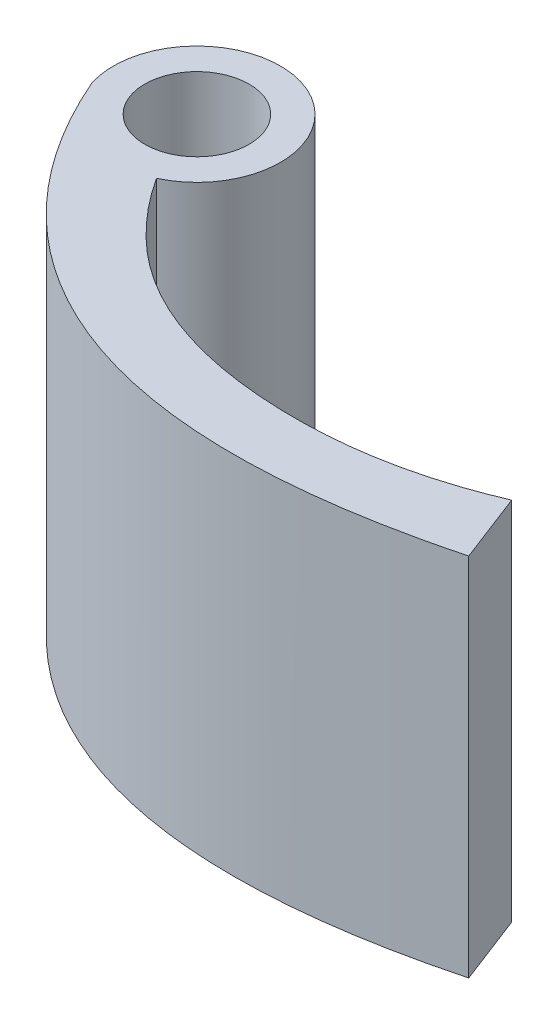
ISO-10303-21;
HEADER;
FILE_DESCRIPTION(('STEP AP214'),'2;1');
FILE_NAME('part.step','',(''),(''),'','','');
FILE_SCHEMA(('AUTOMOTIVE_DESIGN { 1 0 10303 214 1 1 1 1 }'));
ENDSEC;
DATA;
#1=APPLICATION_CONTEXT('core data for automotive mechanical design processes');
#2=APPLICATION_PROTOCOL_DEFINITION('international standard','automotive_design',2000,#1);
#3=PRODUCT_CONTEXT('',#1,'mechanical');
#4=PRODUCT('Part','Part','',(#3));
#5=PRODUCT_RELATED_PRODUCT_CATEGORY('part','',(#4));
#6=PRODUCT_DEFINITION_FORMATION('','',#4);
#7=PRODUCT_DEFINITION_CONTEXT('part definition',#1,'design');
#8=PRODUCT_DEFINITION('design','',#6,#7);
#9=PRODUCT_DEFINITION_SHAPE('','',#8);
#10=(LENGTH_UNIT() NAMED_UNIT(*) SI_UNIT(.MILLI.,.METRE.));
#11=(NAMED_UNIT(*) PLANE_ANGLE_UNIT() SI_UNIT($,.RADIAN.));
#12=(NAMED_UNIT(*) SI_UNIT($,.STERADIAN.) SOLID_ANGLE_UNIT());
#13=UNCERTAINTY_MEASURE_WITH_UNIT(LENGTH_MEASURE(1.E-05),#10,'distance_accuracy_value','');
#14=(GEOMETRIC_REPRESENTATION_CONTEXT(3) GLOBAL_UNCERTAINTY_ASSIGNED_CONTEXT((#13)) GLOBAL_UNIT_ASSIGNED_CONTEXT((#10,
#11,#12)) REPRESENTATION_CONTEXT('',''));
#15=CARTESIAN_POINT('',(0.,0.,0.));
#16=DIRECTION('',(0.,0.,1.));
#17=DIRECTION('',(1.,0.,0.));
#18=AXIS2_PLACEMENT_3D('',#15,#16,#17);
#19=CARTESIAN_POINT('',(23.5418795945372,17.5,8.46845520362058));
#20=CARTESIAN_POINT('',(23.5418795945372,0.,8.46845520362058));
#21=CARTESIAN_POINT('',(19.0409249862092,17.5,10.4028454268517));
#22=CARTESIAN_POINT('',(19.0409249862092,0.,10.4028454268517));
#23=CARTESIAN_POINT('',(7.80522684116914,17.5,10.0394228017009));
#24=CARTESIAN_POINT('',(7.80522684116914,0.,10.0394228017009));
#25=CARTESIAN_POINT('',(2.72032425599838,17.5,5.2184871640726));
#26=CARTESIAN_POINT('',(2.72032425599838,0.,5.2184871640726));
#27=CARTESIAN_POINT('',(1.68961459833319,17.5,3.62563132558998));
#28=CARTESIAN_POINT('',(1.68961459833319,0.,3.62563132558998));
#29=B_SPLINE_SURFACE_WITH_KNOTS('',2,1,((#19,#20),(#21,#22),(#23,#24),(#25,#26),(#27,#28)),
.UNSPECIFIED.,.F.,.F.,.F.,(3,1,1,3),(2,2),(0.17505628759707,0.470264311615387,0.86018861941257,
1.),(0.,1.),.UNSPECIFIED.);
#30=DIRECTION('',(0.,-1.,0.));
#31=VECTOR('',#30,1.);
#32=CARTESIAN_POINT('',(1.68961459833319,17.5,3.62563132558998));
#33=LINE('',#32,#31);
#34=CARTESIAN_POINT('',(1.68961459833319,17.5,3.62563132558998));
#35=VERTEX_POINT('',#34);
#36=CARTESIAN_POINT('',(1.68961459833319,0.,3.62563132558998));
#37=VERTEX_POINT('',#36);
#38=EDGE_CURVE('E57',#35,#37,#33,.T.);
#39=CARTESIAN_POINT('',(1.68961459833319,17.5,3.62563132558998));
#40=CARTESIAN_POINT('',(1.79742893716146,17.5,3.79225865819014));
#41=CARTESIAN_POINT('',(1.90825725271313,17.5,3.95694270049313));
#42=CARTESIAN_POINT('',(2.13610975059026,17.5,4.28241168820125));
#43=CARTESIAN_POINT('',(2.25314480809976,17.5,4.44318901829129));
#44=CARTESIAN_POINT('',(2.49331792271185,17.5,4.7603978188839));
#45=CARTESIAN_POINT('',(2.61646248468633,17.5,4.91682436808388));
#46=CARTESIAN_POINT('',(2.86870225490145,17.5,5.22492052723039));
#47=CARTESIAN_POINT('',(2.99780010579572,17.5,5.37658797343195));
#48=CARTESIAN_POINT('',(3.26116791849547,17.5,5.67412904320811));
#49=CARTESIAN_POINT('',(3.39541133849376,17.5,5.8200261217978));
#50=CARTESIAN_POINT('',(3.60090870490553,17.5,6.03485942709481));
#51=CARTESIAN_POINT('',(3.67008653774347,17.5,6.10579213953776));
#52=CARTESIAN_POINT('',(3.80981560194832,17.5,6.24629470557353));
#53=CARTESIAN_POINT('',(3.88036685337873,17.5,6.31586453922697));
#54=CARTESIAN_POINT('',(4.02274332472523,17.5,6.45362141051685));
#55=CARTESIAN_POINT('',(4.09456791553023,17.5,6.52180909719169));
#56=CARTESIAN_POINT('',(4.23984114982229,17.5,6.6564305588526));
#57=CARTESIAN_POINT('',(4.31328973988117,17.5,6.72286439138168));
#58=CARTESIAN_POINT('',(4.46173662228513,17.5,6.85395330264662));
#59=CARTESIAN_POINT('',(4.53673467356528,17.5,6.91860865448297));
#60=CARTESIAN_POINT('',(4.68826351092775,17.5,7.046103420793));
#61=CARTESIAN_POINT('',(4.76479436443847,17.5,7.10894275508121));
#62=CARTESIAN_POINT('',(4.94610376805075,17.5,7.25420740243292));
#63=CARTESIAN_POINT('',(5.05148726410361,17.5,7.33588002515753));
#64=CARTESIAN_POINT('',(5.26483189512984,17.5,7.49577866829648));
#65=CARTESIAN_POINT('',(5.37279307187863,17.5,7.57400463279368));
#66=CARTESIAN_POINT('',(5.70044818129108,17.5,7.80346757368113));
#67=CARTESIAN_POINT('',(5.92385970174721,17.5,7.94944636033349));
#68=CARTESIAN_POINT('',(6.37944578145599,17.5,8.22697814339554));
#69=CARTESIAN_POINT('',(6.61162062681711,17.5,8.35853066826241));
#70=CARTESIAN_POINT('',(7.08347802508193,17.5,8.60706969855418));
#71=CARTESIAN_POINT('',(7.32315659868628,17.5,8.72406376603248));
#72=CARTESIAN_POINT('',(7.80897296275063,17.5,8.94370749564517));
#73=CARTESIAN_POINT('',(8.05511050788914,17.5,9.04635770164712));
#74=CARTESIAN_POINT('',(8.55273735347587,17.5,9.23767056843271));
#75=CARTESIAN_POINT('',(8.80422658843294,17.5,9.32633340027487));
#76=CARTESIAN_POINT('',(9.37861476273707,17.5,9.51184684719253));
#77=CARTESIAN_POINT('',(9.70281812356134,17.5,9.60466704653406));
#78=CARTESIAN_POINT('',(10.3564059279472,17.5,9.77006946340878));
#79=CARTESIAN_POINT('',(10.6857919966434,17.5,9.84264519370544));
#80=CARTESIAN_POINT('',(11.3482013827009,17.5,9.96898652547715));
#81=CARTESIAN_POINT('',(11.6812255137861,17.5,10.0227478260718));
#82=CARTESIAN_POINT('',(12.3507511028208,17.5,10.1130888000342));
#83=CARTESIAN_POINT('',(12.6872606495866,17.5,10.1496077140701));
#84=CARTESIAN_POINT('',(13.3615563162684,17.5,10.2066583780304));
#85=CARTESIAN_POINT('',(13.6993421957967,17.5,10.2271930010493));
#86=CARTESIAN_POINT('',(14.2064197847899,17.5,10.2470775424825));
#87=CARTESIAN_POINT('',(14.3755175594851,17.5,10.2518861364934));
#88=CARTESIAN_POINT('',(14.7137783713298,17.5,10.2576447090449));
#89=CARTESIAN_POINT('',(14.882941407882,17.5,10.2585947220956));
#90=CARTESIAN_POINT('',(15.4084969940953,17.5,10.255520176609));
#91=CARTESIAN_POINT('',(15.7648752123894,17.5,10.2448254542903));
#92=CARTESIAN_POINT('',(16.4766362091217,17.5,10.2058791316273));
#93=CARTESIAN_POINT('',(16.8320190534104,17.5,10.1776287216498));
#94=CARTESIAN_POINT('',(17.5409487971854,17.5,10.1034317676877));
#95=CARTESIAN_POINT('',(17.894495647915,17.5,10.0574847561615));
#96=CARTESIAN_POINT('',(18.5976596109128,17.5,9.94810661541723));
#97=CARTESIAN_POINT('',(18.9472859222005,17.5,9.8847345972942));
#98=CARTESIAN_POINT('',(19.6429467993597,17.5,9.74064574064057));
#99=CARTESIAN_POINT('',(19.9889813456516,17.5,9.65992880761108));
#100=CARTESIAN_POINT('',(20.6765270212143,17.5,9.48155653006617));
#101=CARTESIAN_POINT('',(21.018039631,17.5,9.38390688483203));
#102=CARTESIAN_POINT('',(21.7277888124359,17.5,9.16220924181312));
#103=CARTESIAN_POINT('',(22.0955197985764,17.5,9.03654262418113));
#104=CARTESIAN_POINT('',(22.8240915503298,17.5,8.76638971190001));
#105=CARTESIAN_POINT('',(23.1849309210635,17.5,8.62189965267261));
#106=CARTESIAN_POINT('',(23.5418795945372,17.5,8.46845520362058));
#107=B_SPLINE_CURVE_WITH_KNOTS('',3,(#39,#40,#41,#42,#43,#44,#45,#46,#47,#48,#49,#50,#51,#52,
#53,#54,#55,#56,#57,#58,#59,#60,#61,#62,#63,#64,#65,#66,#67,#68,#69,#70,#71,#72,#73,#74,#75,#76,
#77,#78,#79,#80,#81,#82,#83,#84,#85,#86,#87,#88,#89,#90,#91,#92,#93,#94,#95,#96,#97,#98,#99,
#100,#101,#102,#103,#104,#105,#106),.UNSPECIFIED.,.F.,.F.,(4,2,2,2,2,2,2,2,2,2,2,2,2,2,2,2,2,2,
2,2,2,2,2,2,2,2,2,2,2,2,2,2,2,4),(0.,0.595373025180184,1.19182611590377,1.78892848903527,
2.38629851531379,2.98091891255163,3.2781457209828,3.57537687469617,3.87246505813082,
4.16954348211604,4.4665760296479,4.76362167254798,5.16352665045545,5.56343811386557,
6.36346816489227,7.16352435824588,7.96316323071633,8.76277177552837,9.56237054077345,
10.573322896226,11.5845988350064,12.5961057954167,13.6111510173321,14.6260137479118,
15.133477787213,15.6409372878901,16.7100913971856,17.7791730201812,18.8482828900875,
19.9138098201943,20.9793425556723,22.0445173434853,23.2098194851185,24.3753550391754),.UNSPECIFIED.);
#108=CARTESIAN_POINT('',(23.5418795945372,17.5,8.46845520362058));
#109=VERTEX_POINT('',#108);
#110=EDGE_CURVE('E60',#35,#109,#107,.T.);
#111=DIRECTION('',(0.,1.,0.));
#112=VECTOR('',#111,1.);
#113=CARTESIAN_POINT('',(23.5418795945372,17.5,8.46845520362058));
#114=LINE('',#113,#112);
#115=CARTESIAN_POINT('',(23.5418795945372,0.,8.46845520362058));
#116=VERTEX_POINT('',#115);
#117=EDGE_CURVE('E90',#109,#116,#114,.F.);
#118=CARTESIAN_POINT('',(1.68961459833319,0.,3.62563132558998));
#119=CARTESIAN_POINT('',(1.79742893716146,0.,3.79225865819014));
#120=CARTESIAN_POINT('',(1.90825725271313,0.,3.95694270049313));
#121=CARTESIAN_POINT('',(2.13610975059026,0.,4.28241168820125));
#122=CARTESIAN_POINT('',(2.25314480809976,0.,4.4431890182913));
#123=CARTESIAN_POINT('',(2.49331792271185,0.,4.7603978188839));
#124=CARTESIAN_POINT('',(2.61646248468633,0.,4.91682436808388));
#125=CARTESIAN_POINT('',(2.86870225490145,0.,5.22492052723039));
#126=CARTESIAN_POINT('',(2.99780010579572,0.,5.37658797343196));
#127=CARTESIAN_POINT('',(3.26116791849547,0.,5.67412904320811));
#128=CARTESIAN_POINT('',(3.39541133849376,0.,5.82002612179781));
#129=CARTESIAN_POINT('',(3.60090870490553,0.,6.03485942709481));
#130=CARTESIAN_POINT('',(3.67008653774347,0.,6.10579213953777));
#131=CARTESIAN_POINT('',(3.80981560194832,0.,6.24629470557353));
#132=CARTESIAN_POINT('',(3.88036685337873,0.,6.31586453922697));
#133=CARTESIAN_POINT('',(4.02274332472524,0.,6.45362141051685));
#134=CARTESIAN_POINT('',(4.09456791553023,0.,6.52180909719169));
#135=CARTESIAN_POINT('',(4.23984114982229,0.,6.6564305588526));
#136=CARTESIAN_POINT('',(4.31328973988117,0.,6.72286439138168));
#137=CARTESIAN_POINT('',(4.46173662228513,0.,6.85395330264662));
#138=CARTESIAN_POINT('',(4.53673467356528,0.,6.91860865448297));
#139=CARTESIAN_POINT('',(4.68826351092775,0.,7.046103420793));
#140=CARTESIAN_POINT('',(4.76479436443847,0.,7.10894275508121));
#141=CARTESIAN_POINT('',(4.94610376805075,0.,7.25420740243292));
#142=CARTESIAN_POINT('',(5.05148726410362,0.,7.33588002515753));
#143=CARTESIAN_POINT('',(5.26483189512984,0.,7.49577866829648));
#144=CARTESIAN_POINT('',(5.37279307187863,0.,7.57400463279368));
#145=CARTESIAN_POINT('',(5.70044818129108,0.,7.80346757368113));
#146=CARTESIAN_POINT('',(5.92385970174721,0.,7.94944636033349));
#147=CARTESIAN_POINT('',(6.37944578145599,0.,8.22697814339554));
#148=CARTESIAN_POINT('',(6.6116206268171,0.,8.35853066826241));
#149=CARTESIAN_POINT('',(7.08347802508193,0.,8.60706969855418));
#150=CARTESIAN_POINT('',(7.32315659868628,0.,8.72406376603248));
#151=CARTESIAN_POINT('',(7.80897296275063,0.,8.94370749564517));
#152=CARTESIAN_POINT('',(8.05511050788914,0.,9.04635770164712));
#153=CARTESIAN_POINT('',(8.55273735347587,0.,9.23767056843271));
#154=CARTESIAN_POINT('',(8.80422658843293,0.,9.32633340027487));
#155=CARTESIAN_POINT('',(9.37861476273707,0.,9.51184684719253));
#156=CARTESIAN_POINT('',(9.70281812356134,0.,9.60466704653406));
#157=CARTESIAN_POINT('',(10.3564059279472,0.,9.77006946340878));
#158=CARTESIAN_POINT('',(10.6857919966434,0.,9.84264519370544));
#159=CARTESIAN_POINT('',(11.3482013827009,0.,9.96898652547715));
#160=CARTESIAN_POINT('',(11.6812255137861,0.,10.0227478260718));
#161=CARTESIAN_POINT('',(12.3507511028208,0.,10.1130888000342));
#162=CARTESIAN_POINT('',(12.6872606495866,0.,10.1496077140701));
#163=CARTESIAN_POINT('',(13.3615563162684,0.,10.2066583780304));
#164=CARTESIAN_POINT('',(13.6993421957967,0.,10.2271930010493));
#165=CARTESIAN_POINT('',(14.2064197847899,0.,10.2470775424825));
#166=CARTESIAN_POINT('',(14.3755175594851,0.,10.2518861364934));
#167=CARTESIAN_POINT('',(14.7137783713298,0.,10.2576447090449));
#168=CARTESIAN_POINT('',(14.882941407882,0.,10.2585947220956));
#169=CARTESIAN_POINT('',(15.4084969940953,0.,10.255520176609));
#170=CARTESIAN_POINT('',(15.7648752123895,0.,10.2448254542903));
#171=CARTESIAN_POINT('',(16.4766362091217,0.,10.2058791316273));
#172=CARTESIAN_POINT('',(16.8320190534104,0.,10.1776287216498));
#173=CARTESIAN_POINT('',(17.5409487971854,0.,10.1034317676877));
#174=CARTESIAN_POINT('',(17.894495647915,0.,10.0574847561615));
#175=CARTESIAN_POINT('',(18.5976596109128,0.,9.94810661541723));
#176=CARTESIAN_POINT('',(18.9472859222006,0.,9.88473459729419));
#177=CARTESIAN_POINT('',(19.6429467993597,0.,9.74064574064056));
#178=CARTESIAN_POINT('',(19.9889813456516,0.,9.65992880761108));
#179=CARTESIAN_POINT('',(20.6765270212143,0.,9.48155653006617));
#180=CARTESIAN_POINT('',(21.018039631,0.,9.38390688483203));
#181=CARTESIAN_POINT('',(21.7277888124359,0.,9.16220924181312));
#182=CARTESIAN_POINT('',(22.0955197985764,0.,9.03654262418112));
#183=CARTESIAN_POINT('',(22.8240915503298,0.,8.76638971190001));
#184=CARTESIAN_POINT('',(23.1849309210635,0.,8.62189965267261));
#185=CARTESIAN_POINT('',(23.5418795945372,0.,8.46845520362058));
#186=B_SPLINE_CURVE_WITH_KNOTS('',3,(#118,#119,#120,#121,#122,#123,#124,#125,#126,#127,#128,
#129,#130,#131,#132,#133,#134,#135,#136,#137,#138,#139,#140,#141,#142,#143,#144,#145,#146,#147,
#148,#149,#150,#151,#152,#153,#154,#155,#156,#157,#158,#159,#160,#161,#162,#163,#164,#165,#166,
#167,#168,#169,#170,#171,#172,#173,#174,#175,#176,#177,#178,#179,#180,#181,#182,#183,#184,#185),
.UNSPECIFIED.,.F.,.F.,(4,2,2,2,2,2,2,2,2,2,2,2,2,2,2,2,2,2,2,2,2,2,2,2,2,2,2,2,2,2,2,2,2,4),(0.,
0.595373025180184,1.19182611590377,1.78892848903527,2.38629851531379,2.98091891255163,
3.2781457209828,3.57537687469617,3.87246505813082,4.16954348211604,4.4665760296479,
4.76362167254798,5.16352665045545,5.56343811386557,6.36346816489227,7.16352435824588,
7.96316323071633,8.76277177552837,9.56237054077345,10.573322896226,11.5845988350064,
12.5961057954167,13.6111510173321,14.6260137479118,15.133477787213,15.6409372878901,
16.7100913971856,17.7791730201812,18.8482828900876,19.9138098201943,20.9793425556723,
22.0445173434853,23.2098194851185,24.3753550391754),.UNSPECIFIED.);
#187=EDGE_CURVE('E62',#37,#116,#186,.T.);
#188=ORIENTED_EDGE('',*,*,#38,.F.);
#189=ORIENTED_EDGE('',*,*,#110,.T.);
#190=ORIENTED_EDGE('',*,*,#117,.T.);
#191=ORIENTED_EDGE('',*,*,#187,.F.);
#192=EDGE_LOOP('',(#188,#189,#190,#191));
#193=FACE_BOUND('',#192,.T.);
#194=ADVANCED_FACE('F17',(#193),#29,.F.);
#195=CARTESIAN_POINT('',(0.,17.5,0.));
#196=DIRECTION('',(0.,-1.,0.));
#197=DIRECTION('',(0.,0.,-1.));
#198=AXIS2_PLACEMENT_3D('',#195,#196,#197);
#199=CYLINDRICAL_SURFACE('',#198,2.5);
#200=CARTESIAN_POINT('',(0.,17.5,0.));
#201=DIRECTION('',(0.,-1.,0.));
#202=DIRECTION('',(0.,0.,-1.));
#203=AXIS2_PLACEMENT_3D('',#200,#201,#202);
#204=CIRCLE('',#203,2.5);
#205=CARTESIAN_POINT('',(0.,17.5,-2.5));
#206=VERTEX_POINT('',#205);
#207=EDGE_CURVE('E74',#206,#206,#204,.F.);
#208=ORIENTED_EDGE('',*,*,#207,.T.);
#209=EDGE_LOOP('',(#208));
#210=FACE_BOUND('',#209,.T.);
#211=CARTESIAN_POINT('',(0.,0.,0.));
#212=DIRECTION('',(0.,-1.,0.));
#213=DIRECTION('',(0.,0.,-1.));
#214=AXIS2_PLACEMENT_3D('',#211,#212,#213);
#215=CIRCLE('',#214,2.5);
#216=CARTESIAN_POINT('',(0.,0.,-2.5));
#217=VERTEX_POINT('',#216);
#218=EDGE_CURVE('E82',#217,#217,#215,.F.);
#219=ORIENTED_EDGE('',*,*,#218,.F.);
#220=EDGE_LOOP('',(#219));
#221=FACE_BOUND('',#220,.T.);
#222=ADVANCED_FACE('F118',(#210,#221),#199,.F.);
#223=CARTESIAN_POINT('',(0.,17.5,0.));
#224=DIRECTION('',(0.,-1.,0.));
#225=DIRECTION('',(0.,0.,-1.));
#226=AXIS2_PLACEMENT_3D('',#223,#224,#225);
#227=CYLINDRICAL_SURFACE('',#226,4.);
#228=CARTESIAN_POINT('',(0.,0.,0.));
#229=DIRECTION('',(0.,-1.,0.));
#230=DIRECTION('',(0.,0.,-1.));
#231=AXIS2_PLACEMENT_3D('',#228,#229,#230);
#232=CIRCLE('',#231,4.);
#233=CARTESIAN_POINT('',(-3.80556884538777,0.,1.23192766143714));
#234=VERTEX_POINT('',#233);
#235=EDGE_CURVE('E79',#234,#37,#232,.T.);
#236=ORIENTED_EDGE('',*,*,#235,.F.);
#237=DIRECTION('',(0.,1.,0.));
#238=VECTOR('',#237,1.);
#239=CARTESIAN_POINT('',(-3.80556884538777,8.75,1.23192766143714));
#240=LINE('',#239,#238);
#241=CARTESIAN_POINT('',(-3.80556884538777,17.5,1.23192766143714));
#242=VERTEX_POINT('',#241);
#243=EDGE_CURVE('E78',#234,#242,#240,.T.);
#244=ORIENTED_EDGE('',*,*,#243,.T.);
#245=CARTESIAN_POINT('',(0.,17.5,0.));
#246=DIRECTION('',(0.,-1.,0.));
#247=DIRECTION('',(0.,0.,-1.));
#248=AXIS2_PLACEMENT_3D('',#245,#246,#247);
#249=CIRCLE('',#248,4.);
#250=EDGE_CURVE('E24',#242,#35,#249,.T.);
#251=ORIENTED_EDGE('',*,*,#250,.T.);
#252=ORIENTED_EDGE('',*,*,#38,.T.);
#253=EDGE_LOOP('',(#236,#244,#251,#252));
#254=FACE_BOUND('',#253,.T.);
#255=ADVANCED_FACE('F76',(#254),#227,.T.);
#256=CARTESIAN_POINT('',(10.5934418884606,17.5,9.81962069741123));
#257=DIRECTION('',(0.,-1.,0.));
#258=DIRECTION('',(0.,0.,-1.));
#259=AXIS2_PLACEMENT_3D('',#256,#257,#258);
#260=PLANE('',#259);
#261=ORIENTED_EDGE('',*,*,#207,.F.);
#262=EDGE_LOOP('',(#261));
#263=FACE_BOUND('',#262,.T.);
#264=ORIENTED_EDGE('',*,*,#250,.F.);
#265=CARTESIAN_POINT('',(-3.80556884538777,17.5,1.23192766143714));
#266=CARTESIAN_POINT('',(-3.74806260160153,17.5,1.36407463491607));
#267=CARTESIAN_POINT('',(-3.68942044940947,17.5,1.49572403299078));
#268=CARTESIAN_POINT('',(-3.56985687977397,17.5,1.75798648824177));
#269=CARTESIAN_POINT('',(-3.50893542154176,17.5,1.88859952682138));
#270=CARTESIAN_POINT('',(-3.32258169203165,17.5,2.27915553993106));
#271=CARTESIAN_POINT('',(-3.1937104761506,17.5,2.53746944890253));
#272=CARTESIAN_POINT('',(-2.92641700606305,17.5,3.04932172797881));
#273=CARTESIAN_POINT('',(-2.78798864450031,17.5,3.30285691009652));
#274=CARTESIAN_POINT('',(-2.50124244517351,17.5,3.80433584784814));
#275=CARTESIAN_POINT('',(-2.35292304635494,17.5,4.05227871257088));
#276=CARTESIAN_POINT('',(-2.0455448754525,17.5,4.54301041943573));
#277=CARTESIAN_POINT('',(-1.88643988528078,17.5,4.78577034195914));
#278=CARTESIAN_POINT('',(-1.55811448599689,17.5,5.26424631446912));
#279=CARTESIAN_POINT('',(-1.38889720570972,17.5,5.49996450971246));
#280=CARTESIAN_POINT('',(-1.04035393879103,17.5,5.96372413182091));
#281=CARTESIAN_POINT('',(-0.861030456932846,17.5,6.19176743868594));
#282=CARTESIAN_POINT('',(-0.49229377393489,17.5,6.6395352935744));
#283=CARTESIAN_POINT('',(-0.302880718787468,17.5,6.85925996188676));
#284=CARTESIAN_POINT('',(0.152969268856561,17.5,7.36387275570645));
#285=CARTESIAN_POINT('',(0.423456292874136,17.5,7.64512457973667));
#286=CARTESIAN_POINT('',(0.982150972541489,17.5,8.18953889658161));
#287=CARTESIAN_POINT('',(1.27036165876602,17.5,8.45269827937938));
#288=CARTESIAN_POINT('',(1.86334209675524,17.5,8.95964025114364));
#289=CARTESIAN_POINT('',(2.16811179001211,17.5,9.20342290856631));
#290=CARTESIAN_POINT('',(2.79194673090215,17.5,9.66964283880401));
#291=CARTESIAN_POINT('',(3.1109583632599,17.5,9.89215165166703));
#292=CARTESIAN_POINT('',(3.59990430574197,17.5,10.209747070966));
#293=CARTESIAN_POINT('',(3.76463506427807,17.5,10.3129235618192));
#294=CARTESIAN_POINT('',(4.09741652456407,17.5,10.5137779775494));
#295=CARTESIAN_POINT('',(4.26546720220276,17.5,10.6114559423402));
#296=CARTESIAN_POINT('',(4.774191279381,17.5,10.8961521138022));
#297=CARTESIAN_POINT('',(5.11952630624187,17.5,11.0748906954618));
#298=CARTESIAN_POINT('',(5.9240733619031,17.5,11.459411130872));
#299=CARTESIAN_POINT('',(6.38689922123636,17.5,11.657679707714));
#300=CARTESIAN_POINT('',(7.0916510501915,17.5,11.9270366167184));
#301=CARTESIAN_POINT('',(7.32832823236788,17.5,12.0121501990994));
#302=CARTESIAN_POINT('',(7.8048176217886,17.5,12.1731022067232));
#303=CARTESIAN_POINT('',(8.04462980533238,17.5,12.2489407020406));
#304=CARTESIAN_POINT('',(8.768704673339,17.5,12.4629772092574));
#305=CARTESIAN_POINT('',(9.25706760236575,17.5,12.5874919653495));
#306=CARTESIAN_POINT('',(10.241323864699,17.5,12.8017987145127));
#307=CARTESIAN_POINT('',(10.737218290119,17.5,12.8915856208936));
#308=CARTESIAN_POINT('',(11.6224556768102,17.5,13.0221588883804));
#309=CARTESIAN_POINT('',(12.0108634426111,17.5,13.0694101456768));
#310=CARTESIAN_POINT('',(12.789510158126,17.5,13.1453082917107));
#311=CARTESIAN_POINT('',(13.1797493130722,17.5,13.1739530426437));
#312=CARTESIAN_POINT('',(14.3520769561725,17.5,13.2336994381172));
#313=CARTESIAN_POINT('',(15.1355782042629,17.5,13.2385853779101));
#314=CARTESIAN_POINT('',(16.7023867095151,17.5,13.1880808309422));
#315=CARTESIAN_POINT('',(17.485687986924,17.5,13.1325310839471));
#316=CARTESIAN_POINT('',(18.6562887072219,17.5,13.0104604641429));
#317=CARTESIAN_POINT('',(19.0457366826378,17.5,12.9633172392363));
#318=CARTESIAN_POINT('',(19.8230021859374,17.5,12.8571337222766));
#319=CARTESIAN_POINT('',(20.2108197826956,17.5,12.7980939380496));
#320=CARTESIAN_POINT('',(20.9551307005114,17.5,12.6738499883816));
#321=CARTESIAN_POINT('',(21.3117606861095,17.5,12.6094574890489));
#322=CARTESIAN_POINT('',(22.0232486951621,17.5,12.4717831400233));
#323=CARTESIAN_POINT('',(22.3781069612616,17.5,12.398502544415));
#324=CARTESIAN_POINT('',(22.9079150979006,17.5,12.2827682790239));
#325=CARTESIAN_POINT('',(23.0835374792932,17.5,12.2433587806763));
#326=CARTESIAN_POINT('',(23.4343478377058,17.5,12.1626485970846));
#327=CARTESIAN_POINT('',(23.6095358152143,17.5,12.1213479139677));
#328=CARTESIAN_POINT('',(23.9594807629354,17.5,12.036910677783));
#329=CARTESIAN_POINT('',(24.1342377035021,17.5,11.9937740019702));
#330=CARTESIAN_POINT('',(24.4832935374445,17.5,11.9056901204786));
#331=CARTESIAN_POINT('',(24.6575924337603,17.5,11.8607429264516));
#332=CARTESIAN_POINT('',(24.8316558001613,17.5,11.8149015748881));
#333=B_SPLINE_CURVE_WITH_KNOTS('',3,(#265,#266,#267,#268,#269,#270,#271,#272,#273,#274,#275,
#276,#277,#278,#279,#280,#281,#282,#283,#284,#285,#286,#287,#288,#289,#290,#291,#292,#293,#294,
#295,#296,#297,#298,#299,#300,#301,#302,#303,#304,#305,#306,#307,#308,#309,#310,#311,#312,#313,
#314,#315,#316,#317,#318,#319,#320,#321,#322,#323,#324,#325,#326,#327,#328,#329,#330,#331,#332),
.UNSPECIFIED.,.F.,.F.,(4,2,2,2,2,2,2,2,2,2,2,2,2,2,2,2,2,2,2,2,2,2,2,2,2,2,2,2,2,2,2,2,2,4),(0.,
0.432340284528741,0.864688309602565,1.7305154760349,2.59690115174656,3.46342389001117,
4.33392851163247,5.20416517272912,6.07418709036519,6.94419642252753,8.11400601925969,
9.28401620131199,10.4540222496435,11.6199441458104,12.2029784837624,12.7860085889285,
13.9517491301165,15.4604346127382,16.2148255781915,16.9692108437556,18.4797033840532,
19.9904170869232,21.163769907846,22.3372575179369,24.6848285503754,27.0386009237843,
28.2153226466725,29.3919941497008,30.4790708715796,31.5659943881336,32.1059556240501,
32.6459162526261,33.1859130370613,33.7259063468721),.UNSPECIFIED.);
#334=CARTESIAN_POINT('',(24.8316558001613,17.5,11.8149015748881));
#335=VERTEX_POINT('',#334);
#336=EDGE_CURVE('E81',#242,#335,#333,.T.);
#337=ORIENTED_EDGE('',*,*,#336,.T.);
#338=DIRECTION('',(0.35963031457441,0.,0.933094870224411));
#339=VECTOR('',#338,1.);
#340=CARTESIAN_POINT('',(23.5418795945372,17.5,8.46845520362058));
#341=LINE('',#340,#339);
#342=EDGE_CURVE('E73',#335,#109,#341,.F.);
#343=ORIENTED_EDGE('',*,*,#342,.T.);
#344=ORIENTED_EDGE('',*,*,#110,.F.);
#345=EDGE_LOOP('',(#264,#337,#343,#344));
#346=FACE_BOUND('',#345,.T.);
#347=ADVANCED_FACE('F70',(#263,#346),#260,.F.);
#348=CARTESIAN_POINT('',(23.5418795945372,17.5,8.46845520362058));
#349=DIRECTION('',(-0.933094870224411,0.,0.35963031457441));
#350=DIRECTION('',(0.35963031457441,0.,0.933094870224411));
#351=AXIS2_PLACEMENT_3D('',#348,#349,#350);
#352=PLANE('',#351);
#353=ORIENTED_EDGE('',*,*,#117,.F.);
#354=ORIENTED_EDGE('',*,*,#342,.F.);
#355=DIRECTION('',(0.,-1.,0.));
#356=VECTOR('',#355,1.);
#357=CARTESIAN_POINT('',(24.8316558001613,8.75,11.8149015748881));
#358=LINE('',#357,#356);
#359=CARTESIAN_POINT('',(24.8316558001613,0.,11.8149015748881));
#360=VERTEX_POINT('',#359);
#361=EDGE_CURVE('E30',#335,#360,#358,.T.);
#362=ORIENTED_EDGE('',*,*,#361,.T.);
#363=DIRECTION('',(0.359630314574409,0.,0.933094870224411));
#364=VECTOR('',#363,1.);
#365=CARTESIAN_POINT('',(23.5418795945372,0.,8.46845520362058));
#366=LINE('',#365,#364);
#367=EDGE_CURVE('E38',#116,#360,#366,.T.);
#368=ORIENTED_EDGE('',*,*,#367,.F.);
#369=EDGE_LOOP('',(#353,#354,#362,#368));
#370=FACE_BOUND('',#369,.T.);
#371=ADVANCED_FACE('F104',(#370),#352,.F.);
#372=CARTESIAN_POINT('',(10.5934418884606,0.,9.81962069741123));
#373=DIRECTION('',(0.,-1.,0.));
#374=DIRECTION('',(0.,0.,-1.));
#375=AXIS2_PLACEMENT_3D('',#372,#373,#374);
#376=PLANE('',#375);
#377=ORIENTED_EDGE('',*,*,#218,.T.);
#378=EDGE_LOOP('',(#377));
#379=FACE_BOUND('',#378,.T.);
#380=CARTESIAN_POINT('',(24.8316558001613,0.,11.8149015748881));
#381=CARTESIAN_POINT('',(24.6793574655154,0.,11.8550141212755));
#382=CARTESIAN_POINT('',(24.5268786913035,0.,11.8944378149481));
#383=CARTESIAN_POINT('',(24.2215691540658,0.,11.9719006558576));
#384=CARTESIAN_POINT('',(24.068738389505,0.,12.0099397970442));
#385=CARTESIAN_POINT('',(23.6097128548287,0.,12.1219746388422));
#386=CARTESIAN_POINT('',(23.3030053416287,0.,12.1938823577009));
#387=CARTESIAN_POINT('',(22.6870161040976,0.,12.3320521003183));
#388=CARTESIAN_POINT('',(22.3777289853659,0.,12.398290105803));
#389=CARTESIAN_POINT('',(21.7578238570635,0.,12.524193430478));
#390=CARTESIAN_POINT('',(21.4472058791179,0.,12.5838589049612));
#391=CARTESIAN_POINT('',(20.8242430046393,0.,12.6962644038735));
#392=CARTESIAN_POINT('',(20.5118962417806,0.,12.748994127946));
#393=CARTESIAN_POINT('',(19.8860496311574,0.,12.84707125125));
#394=CARTESIAN_POINT('',(19.5725497697148,0.,12.8924185626207));
#395=CARTESIAN_POINT('',(18.6192179974206,0.,13.0181535758136));
#396=CARTESIAN_POINT('',(17.977687832593,0.,13.0861896064652));
#397=CARTESIAN_POINT('',(16.6925063930492,0.,13.18499628004));
#398=CARTESIAN_POINT('',(16.0488587223628,0.,13.2158129018084));
#399=CARTESIAN_POINT('',(14.7613533493034,0.,13.2352606515065));
#400=CARTESIAN_POINT('',(14.1174963355301,0.,13.2239290457515));
#401=CARTESIAN_POINT('',(12.9103153351997,0.,13.1579730256435));
#402=CARTESIAN_POINT('',(12.3467023445291,0.,13.1087704920355));
#403=CARTESIAN_POINT('',(11.2243133138883,0.,12.9703007127936));
#404=CARTESIAN_POINT('',(10.6655375398837,0.,12.8810312782371));
#405=CARTESIAN_POINT('',(9.55928028542992,0.,12.6598858176035));
#406=CARTESIAN_POINT('',(9.0117556467398,0.,12.5282301168252));
#407=CARTESIAN_POINT('',(8.20024198542091,0.,12.296791948657));
#408=CARTESIAN_POINT('',(7.93133566928933,0.,12.2139752055124));
#409=CARTESIAN_POINT('',(7.39737566471026,0.,12.0367572597072));
#410=CARTESIAN_POINT('',(7.1323216997765,0.,11.9423568930502));
#411=CARTESIAN_POINT('',(6.51510926642851,0.,11.7069714508897));
#412=CARTESIAN_POINT('',(6.16475890806397,0.,11.5612113588107));
#413=CARTESIAN_POINT('',(5.47364070008153,0.,11.2484497263643));
#414=CARTESIAN_POINT('',(5.1328735175735,0.,11.0814467116691));
#415=CARTESIAN_POINT('',(4.4625375569393,0.,10.7262843754557));
#416=CARTESIAN_POINT('',(4.13296854328888,0.,10.538125499255));
#417=CARTESIAN_POINT('',(3.48646574742462,0.,10.1408080510479));
#418=CARTESIAN_POINT('',(3.16953960874463,0.,9.93163703664958));
#419=CARTESIAN_POINT('',(2.54974100290389,0.,9.49341204852243));
#420=CARTESIAN_POINT('',(2.24686905874711,0.,9.26435733576325));
#421=CARTESIAN_POINT('',(1.65636773232877,0.,8.78746018611437));
#422=CARTESIAN_POINT('',(1.36873557628617,0.,8.53962118823349));
#423=CARTESIAN_POINT('',(0.902854980750665,0.,8.11173662988032));
#424=CARTESIAN_POINT('',(0.720075243532042,0.,7.93659638752805));
#425=CARTESIAN_POINT('',(0.362001608268905,0.,7.5788157003193));
#426=CARTESIAN_POINT('',(0.186708097288756,0.,7.39617486861123));
#427=CARTESIAN_POINT('',(-0.327745401606978,0.,6.8377985395844));
#428=CARTESIAN_POINT('',(-0.655567229506614,0.,6.45152725667728));
#429=CARTESIAN_POINT('',(-1.28041641773467,0.,5.65469940523331));
#430=CARTESIAN_POINT('',(-1.57743290980276,0.,5.24413434543277));
#431=CARTESIAN_POINT('',(-1.99967046810384,0.,4.61291065780066));
#432=CARTESIAN_POINT('',(-2.1365331292211,0.,4.39994359442921));
#433=CARTESIAN_POINT('',(-2.40256739538478,0.,3.96926315698572));
#434=CARTESIAN_POINT('',(-2.53173946565198,0.,3.7515500711017));
#435=CARTESIAN_POINT('',(-2.76349096366429,0.,3.34518175778674));
#436=CARTESIAN_POINT('',(-2.86713160179214,0.,3.15712945582177));
#437=CARTESIAN_POINT('',(-3.06909687035862,0.,2.77823602383293));
#438=CARTESIAN_POINT('',(-3.16742246397327,0.,2.58739540711525));
#439=CARTESIAN_POINT('',(-3.35862952258416,0.,2.20380748586282));
#440=CARTESIAN_POINT('',(-3.45152812918579,0.,2.01106871525655));
#441=CARTESIAN_POINT('',(-3.63230387177996,0.,1.62322254522757));
#442=CARTESIAN_POINT('',(-3.72018042175123,0.,1.42811487258649));
#443=CARTESIAN_POINT('',(-3.80556884538777,0.,1.23192766143714));
#444=B_SPLINE_CURVE_WITH_KNOTS('',3,(#380,#381,#382,#383,#384,#385,#386,#387,#388,#389,#390,
#391,#392,#393,#394,#395,#396,#397,#398,#399,#400,#401,#402,#403,#404,#405,#406,#407,#408,#409,
#410,#411,#412,#413,#414,#415,#416,#417,#418,#419,#420,#421,#422,#423,#424,#425,#426,#427,#428,
#429,#430,#431,#432,#433,#434,#435,#436,#437,#438,#439,#440,#441,#442,#443),.UNSPECIFIED.,.F.,
.F.,(4,2,2,2,2,2,2,2,2,2,2,2,2,2,2,2,2,2,2,2,2,2,2,2,2,2,2,2,2,2,2,4),(0.,0.472473107090242,
0.944948278645242,1.88996220417751,2.83879945181495,3.78761427594845,4.73782265714569,
5.68804234630527,7.62240617237177,9.55437793774323,11.4846419125043,13.1806083537997,
14.8766674598989,16.5640490019974,17.4079356997822,18.2517615290606,19.3894239297846,
20.5271653310955,21.6648827881545,22.8032779639528,23.9417154693572,25.0799450518487,
25.8391685935805,26.598431342447,28.1165952896133,29.635293042766,30.3946177244339,
31.1538964261118,31.7979762288618,32.4419389194433,33.083743361571,33.7256225432591),.UNSPECIFIED.);
#445=EDGE_CURVE('E11',#360,#234,#444,.T.);
#446=ORIENTED_EDGE('',*,*,#445,.T.);
#447=ORIENTED_EDGE('',*,*,#235,.T.);
#448=ORIENTED_EDGE('',*,*,#187,.T.);
#449=ORIENTED_EDGE('',*,*,#367,.T.);
#450=EDGE_LOOP('',(#446,#447,#448,#449));
#451=FACE_BOUND('',#450,.T.);
#452=ADVANCED_FACE('F100',(#379,#451),#376,.T.);
#453=CARTESIAN_POINT('',(-3.80556884538777,17.5,1.23192766143714));
#454=CARTESIAN_POINT('',(-3.80556884538777,0.,1.23192766143714));
#455=CARTESIAN_POINT('',(-3.52894661354001,17.5,1.86761472823672));
#456=CARTESIAN_POINT('',(-3.52894661354001,0.,1.86761472823672));
#457=CARTESIAN_POINT('',(-2.91873841885721,17.5,3.12557694757662));
#458=CARTESIAN_POINT('',(-2.91873841885721,0.,3.12557694757662));
#459=CARTESIAN_POINT('',(-1.51508795271248,17.5,5.45453998995459));
#460=CARTESIAN_POINT('',(-1.51508795271248,0.,5.45453998995459));
#461=CARTESIAN_POINT('',(0.623426846289678,17.5,8.04562159729289));
#462=CARTESIAN_POINT('',(0.623426846289678,0.,8.04562159729289));
#463=CARTESIAN_POINT('',(3.78187340883226,17.5,10.4980157891063));
#464=CARTESIAN_POINT('',(3.78187340883226,0.,10.4980157891063));
#465=CARTESIAN_POINT('',(7.4187297886314,17.5,12.1897286315684));
#466=CARTESIAN_POINT('',(7.4187297886314,0.,12.1897286315684));
#467=CARTESIAN_POINT('',(11.3898374200088,17.5,13.110549791069));
#468=CARTESIAN_POINT('',(11.3898374200088,0.,13.110549791069));
#469=CARTESIAN_POINT('',(15.6095903802641,17.5,13.3267167549343));
#470=CARTESIAN_POINT('',(15.6095903802641,0.,13.3267167549343));
#471=CARTESIAN_POINT('',(19.3307526186566,17.5,12.9773122994089));
#472=CARTESIAN_POINT('',(19.3307526186566,0.,12.9773122994089));
#473=CARTESIAN_POINT('',(22.4195606686676,17.5,12.4100568526505));
#474=CARTESIAN_POINT('',(22.4195606686676,0.,12.4100568526505));
#475=CARTESIAN_POINT('',(24.0386197891203,17.5,12.0237826284194));
#476=CARTESIAN_POINT('',(24.0386197891203,0.,12.0237826284194));
#477=CARTESIAN_POINT('',(24.8316558001613,17.5,11.8149015748881));
#478=CARTESIAN_POINT('',(24.8316558001613,0.,11.8149015748881));
#479=B_SPLINE_SURFACE_WITH_KNOTS('',3,1,((#453,#454),(#455,#456),(#457,#458),(#459,#460),(#461,
#462),(#463,#464),(#465,#466),(#467,#468),(#469,#470),(#471,#472),(#473,#474),(#475,#476),(#477,
#478)),.UNSPECIFIED.,.F.,.F.,.F.,(4,1,1,1,1,1,1,1,1,1,4),(2,2),(0.,0.0625,0.125,0.25,0.375,0.5,
0.625,0.75,0.875,0.9375,1.),(0.,1.),.UNSPECIFIED.);
#480=ORIENTED_EDGE('',*,*,#361,.F.);
#481=ORIENTED_EDGE('',*,*,#336,.F.);
#482=ORIENTED_EDGE('',*,*,#243,.F.);
#483=ORIENTED_EDGE('',*,*,#445,.F.);
#484=EDGE_LOOP('',(#480,#481,#482,#483));
#485=FACE_BOUND('',#484,.T.);
#486=ADVANCED_FACE('F19',(#485),#479,.F.);
#487=CLOSED_SHELL('',(#194,#222,#255,#347,#371,#452,#486));
#488=MANIFOLD_SOLID_BREP('B1',#487);
#489=ADVANCED_BREP_SHAPE_REPRESENTATION('',(#18,#488),#14);
#490=SHAPE_DEFINITION_REPRESENTATION(#9,#489);
ENDSEC;
END-ISO-10303-21;
